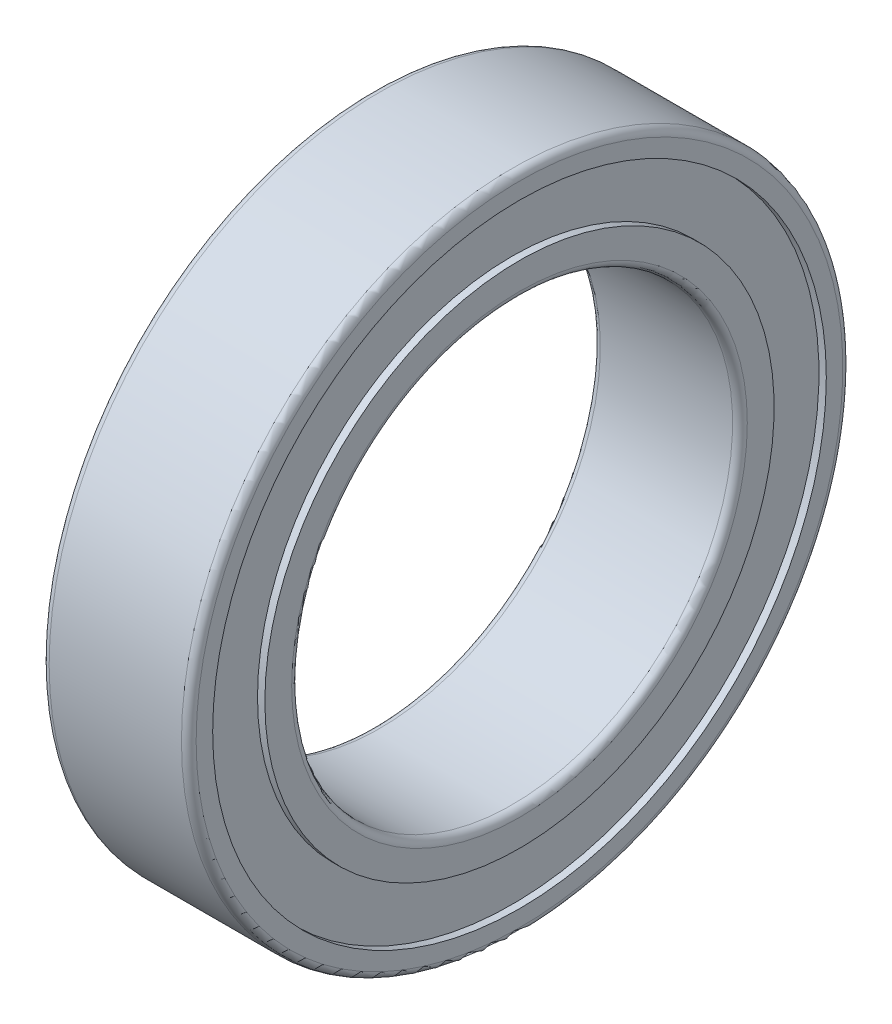
ISO-10303-21;
HEADER;
FILE_DESCRIPTION(('STEP AP214'),'2;1');
FILE_NAME('part.step','',(''),(''),'','','');
FILE_SCHEMA(('AUTOMOTIVE_DESIGN { 1 0 10303 214 1 1 1 1 }'));
ENDSEC;
DATA;
#1=APPLICATION_CONTEXT('core data for automotive mechanical design processes');
#2=APPLICATION_PROTOCOL_DEFINITION('international standard','automotive_design',2000,#1);
#3=PRODUCT_CONTEXT('',#1,'mechanical');
#4=PRODUCT('Part','Part','',(#3));
#5=PRODUCT_RELATED_PRODUCT_CATEGORY('part','',(#4));
#6=PRODUCT_DEFINITION_FORMATION('','',#4);
#7=PRODUCT_DEFINITION_CONTEXT('part definition',#1,'design');
#8=PRODUCT_DEFINITION('design','',#6,#7);
#9=PRODUCT_DEFINITION_SHAPE('','',#8);
#10=(LENGTH_UNIT() NAMED_UNIT(*) SI_UNIT(.MILLI.,.METRE.));
#11=(NAMED_UNIT(*) PLANE_ANGLE_UNIT() SI_UNIT($,.RADIAN.));
#12=(NAMED_UNIT(*) SI_UNIT($,.STERADIAN.) SOLID_ANGLE_UNIT());
#13=UNCERTAINTY_MEASURE_WITH_UNIT(LENGTH_MEASURE(1.E-05),#10,'distance_accuracy_value','');
#14=(GEOMETRIC_REPRESENTATION_CONTEXT(3) GLOBAL_UNCERTAINTY_ASSIGNED_CONTEXT((#13)) GLOBAL_UNIT_ASSIGNED_CONTEXT((#10,
#11,#12)) REPRESENTATION_CONTEXT('',''));
#15=CARTESIAN_POINT('',(0.,0.,0.));
#16=DIRECTION('',(0.,0.,1.));
#17=DIRECTION('',(1.,0.,0.));
#18=AXIS2_PLACEMENT_3D('',#15,#16,#17);
#19=CARTESIAN_POINT('',(0.,-7.11935501410131,-6.93));
#20=DIRECTION('',(-1.,0.,0.));
#21=DIRECTION('',(0.,0.,1.));
#22=AXIS2_PLACEMENT_3D('',#19,#20,#21);
#23=PLANE('',#22);
#24=CARTESIAN_POINT('',(0.,0.,0.));
#25=DIRECTION('',(-1.,0.,0.));
#26=DIRECTION('',(0.,0.,-1.));
#27=AXIS2_PLACEMENT_3D('',#24,#25,#26);
#28=CIRCLE('',#27,6.93);
#29=CARTESIAN_POINT('',(0.,0.,-6.93));
#30=VERTEX_POINT('',#29);
#31=EDGE_CURVE('E68',#30,#30,#28,.F.);
#32=ORIENTED_EDGE('',*,*,#31,.F.);
#33=EDGE_LOOP('',(#32));
#34=FACE_BOUND('',#33,.T.);
#35=CARTESIAN_POINT('',(0.,0.,0.));
#36=DIRECTION('',(1.,0.,0.));
#37=DIRECTION('',(0.,0.,1.));
#38=AXIS2_PLACEMENT_3D('',#35,#36,#37);
#39=CIRCLE('',#38,6.2);
#40=CARTESIAN_POINT('',(0.,0.,6.2));
#41=VERTEX_POINT('',#40);
#42=EDGE_CURVE('E65',#41,#41,#39,.T.);
#43=ORIENTED_EDGE('',*,*,#42,.T.);
#44=EDGE_LOOP('',(#43));
#45=FACE_BOUND('',#44,.T.);
#46=ADVANCED_FACE('F15',(#34,#45),#23,.T.);
#47=CARTESIAN_POINT('',(4.,-7.11935501475615,6.93));
#48=DIRECTION('',(1.,0.,0.));
#49=DIRECTION('',(0.,0.,-1.));
#50=AXIS2_PLACEMENT_3D('',#47,#48,#49);
#51=PLANE('',#50);
#52=CARTESIAN_POINT('',(4.,0.,0.));
#53=DIRECTION('',(1.,0.,0.));
#54=DIRECTION('',(0.,-1.16852482476126E-09,1.));
#55=AXIS2_PLACEMENT_3D('',#52,#53,#54);
#56=CIRCLE('',#55,6.93);
#57=CARTESIAN_POINT('',(4.,-8.0978770355955E-09,6.93));
#58=VERTEX_POINT('',#57);
#59=EDGE_CURVE('E62',#58,#58,#56,.T.);
#60=ORIENTED_EDGE('',*,*,#59,.T.);
#61=EDGE_LOOP('',(#60));
#62=FACE_BOUND('',#61,.T.);
#63=CARTESIAN_POINT('',(4.,0.,0.));
#64=DIRECTION('',(-1.,0.,0.));
#65=DIRECTION('',(0.,0.,-1.));
#66=AXIS2_PLACEMENT_3D('',#63,#64,#65);
#67=CIRCLE('',#66,6.20000011099115);
#68=CARTESIAN_POINT('',(4.,0.,-6.20000011099115));
#69=VERTEX_POINT('',#68);
#70=EDGE_CURVE('E59',#69,#69,#67,.F.);
#71=ORIENTED_EDGE('',*,*,#70,.F.);
#72=EDGE_LOOP('',(#71));
#73=FACE_BOUND('',#72,.T.);
#74=ADVANCED_FACE('F76',(#62,#73),#51,.T.);
#75=CARTESIAN_POINT('',(3.8,-8.57815504645105,8.35));
#76=DIRECTION('',(1.,0.,0.));
#77=DIRECTION('',(0.,0.,-1.));
#78=AXIS2_PLACEMENT_3D('',#75,#76,#77);
#79=PLANE('',#78);
#80=CARTESIAN_POINT('',(3.8,0.,0.));
#81=DIRECTION('',(1.,0.,0.));
#82=DIRECTION('',(0.,0.,1.));
#83=AXIS2_PLACEMENT_3D('',#80,#81,#82);
#84=CIRCLE('',#83,8.35);
#85=CARTESIAN_POINT('',(3.8,0.,8.35));
#86=VERTEX_POINT('',#85);
#87=EDGE_CURVE('E56',#86,#86,#84,.T.);
#88=ORIENTED_EDGE('',*,*,#87,.T.);
#89=EDGE_LOOP('',(#88));
#90=FACE_BOUND('',#89,.T.);
#91=CARTESIAN_POINT('',(3.8,0.,0.));
#92=DIRECTION('',(-1.,0.,0.));
#93=DIRECTION('',(0.,0.,-1.));
#94=AXIS2_PLACEMENT_3D('',#91,#92,#93);
#95=CIRCLE('',#94,6.93);
#96=CARTESIAN_POINT('',(3.8,0.,-6.93));
#97=VERTEX_POINT('',#96);
#98=EDGE_CURVE('E53',#97,#97,#95,.F.);
#99=ORIENTED_EDGE('',*,*,#98,.F.);
#100=EDGE_LOOP('',(#99));
#101=FACE_BOUND('',#100,.T.);
#102=ADVANCED_FACE('F135',(#90,#101),#79,.T.);
#103=CARTESIAN_POINT('',(4.,-9.04045082739751,8.8));
#104=DIRECTION('',(1.,0.,0.));
#105=DIRECTION('',(0.,0.,-1.));
#106=AXIS2_PLACEMENT_3D('',#103,#104,#105);
#107=PLANE('',#106);
#108=CARTESIAN_POINT('',(4.,0.,0.));
#109=DIRECTION('',(1.,0.,0.));
#110=DIRECTION('',(0.,0.,1.));
#111=AXIS2_PLACEMENT_3D('',#108,#109,#110);
#112=CIRCLE('',#111,8.80000011714246);
#113=CARTESIAN_POINT('',(4.,0.,8.80000011714246));
#114=VERTEX_POINT('',#113);
#115=EDGE_CURVE('E50',#114,#114,#112,.T.);
#116=ORIENTED_EDGE('',*,*,#115,.T.);
#117=EDGE_LOOP('',(#116));
#118=FACE_BOUND('',#117,.T.);
#119=CARTESIAN_POINT('',(4.,0.,0.));
#120=DIRECTION('',(-1.,0.,0.));
#121=DIRECTION('',(0.,0.,-1.));
#122=AXIS2_PLACEMENT_3D('',#119,#120,#121);
#123=CIRCLE('',#122,8.35);
#124=CARTESIAN_POINT('',(4.,0.,-8.35));
#125=VERTEX_POINT('',#124);
#126=EDGE_CURVE('E47',#125,#125,#123,.F.);
#127=ORIENTED_EDGE('',*,*,#126,.F.);
#128=EDGE_LOOP('',(#127));
#129=FACE_BOUND('',#128,.T.);
#130=ADVANCED_FACE('F130',(#118,#129),#107,.T.);
#131=CARTESIAN_POINT('',(0.,-9.04045082739751,-8.8));
#132=DIRECTION('',(-1.,0.,0.));
#133=DIRECTION('',(0.,0.,1.));
#134=AXIS2_PLACEMENT_3D('',#131,#132,#133);
#135=PLANE('',#134);
#136=CARTESIAN_POINT('',(0.,0.,0.));
#137=DIRECTION('',(-1.,0.,0.));
#138=DIRECTION('',(0.,0.,-1.));
#139=AXIS2_PLACEMENT_3D('',#136,#137,#138);
#140=CIRCLE('',#139,8.80000000942432);
#141=CARTESIAN_POINT('',(0.,0.,-8.80000000942432));
#142=VERTEX_POINT('',#141);
#143=EDGE_CURVE('E44',#142,#142,#140,.F.);
#144=ORIENTED_EDGE('',*,*,#143,.F.);
#145=EDGE_LOOP('',(#144));
#146=FACE_BOUND('',#145,.T.);
#147=CARTESIAN_POINT('',(0.,0.,0.));
#148=DIRECTION('',(1.,0.,0.));
#149=DIRECTION('',(0.,0.,1.));
#150=AXIS2_PLACEMENT_3D('',#147,#148,#149);
#151=CIRCLE('',#150,8.35);
#152=CARTESIAN_POINT('',(0.,0.,8.35));
#153=VERTEX_POINT('',#152);
#154=EDGE_CURVE('E41',#153,#153,#151,.T.);
#155=ORIENTED_EDGE('',*,*,#154,.T.);
#156=EDGE_LOOP('',(#155));
#157=FACE_BOUND('',#156,.T.);
#158=ADVANCED_FACE('F94',(#146,#157),#135,.T.);
#159=CARTESIAN_POINT('',(0.2,-8.57815504645105,-8.35));
#160=DIRECTION('',(-1.,0.,0.));
#161=DIRECTION('',(0.,0.,1.));
#162=AXIS2_PLACEMENT_3D('',#159,#160,#161);
#163=PLANE('',#162);
#164=CARTESIAN_POINT('',(0.2,0.,0.));
#165=DIRECTION('',(-1.,0.,0.));
#166=DIRECTION('',(0.,0.,-1.));
#167=AXIS2_PLACEMENT_3D('',#164,#165,#166);
#168=CIRCLE('',#167,8.35);
#169=CARTESIAN_POINT('',(0.2,0.,-8.35));
#170=VERTEX_POINT('',#169);
#171=EDGE_CURVE('E38',#170,#170,#168,.F.);
#172=ORIENTED_EDGE('',*,*,#171,.F.);
#173=EDGE_LOOP('',(#172));
#174=FACE_BOUND('',#173,.T.);
#175=CARTESIAN_POINT('',(0.2,0.,0.));
#176=DIRECTION('',(1.,0.,0.));
#177=DIRECTION('',(0.,0.,1.));
#178=AXIS2_PLACEMENT_3D('',#175,#176,#177);
#179=CIRCLE('',#178,6.93);
#180=CARTESIAN_POINT('',(0.2,0.,6.93));
#181=VERTEX_POINT('',#180);
#182=EDGE_CURVE('E35',#181,#181,#179,.T.);
#183=ORIENTED_EDGE('',*,*,#182,.T.);
#184=EDGE_LOOP('',(#183));
#185=FACE_BOUND('',#184,.T.);
#186=ADVANCED_FACE('F83',(#174,#185),#163,.T.);
#187=CARTESIAN_POINT('',(0.200000000000014,0.,0.));
#188=DIRECTION('',(1.,0.,0.));
#189=DIRECTION('',(0.,0.,1.));
#190=AXIS2_PLACEMENT_3D('',#187,#188,#189);
#191=TOROIDAL_SURFACE('',#190,6.2,0.200000000000014);
#192=CARTESIAN_POINT('',(0.2,0.,0.));
#193=DIRECTION('',(1.,0.,0.));
#194=DIRECTION('',(0.,0.,1.));
#195=AXIS2_PLACEMENT_3D('',#192,#193,#194);
#196=CIRCLE('',#195,5.99999999999999);
#197=CARTESIAN_POINT('',(0.2,0.,5.99999999999999));
#198=VERTEX_POINT('',#197);
#199=EDGE_CURVE('E30',#198,#198,#196,.T.);
#200=ORIENTED_EDGE('',*,*,#199,.T.);
#201=EDGE_LOOP('',(#200));
#202=FACE_BOUND('',#201,.T.);
#203=ORIENTED_EDGE('',*,*,#42,.F.);
#204=EDGE_LOOP('',(#203));
#205=FACE_BOUND('',#204,.T.);
#206=ADVANCED_FACE('F80',(#202,#205),#191,.T.);
#207=CARTESIAN_POINT('',(4.,0.,0.));
#208=DIRECTION('',(1.,0.,0.));
#209=DIRECTION('',(0.,0.,1.));
#210=AXIS2_PLACEMENT_3D('',#207,#208,#209);
#211=CYLINDRICAL_SURFACE('',#210,6.);
#212=CARTESIAN_POINT('',(3.8,0.,0.));
#213=DIRECTION('',(1.,0.,0.));
#214=DIRECTION('',(0.,0.,1.));
#215=AXIS2_PLACEMENT_3D('',#212,#213,#214);
#216=CIRCLE('',#215,6.);
#217=CARTESIAN_POINT('',(3.8,0.,6.));
#218=VERTEX_POINT('',#217);
#219=EDGE_CURVE('E26',#218,#218,#216,.T.);
#220=ORIENTED_EDGE('',*,*,#219,.T.);
#221=EDGE_LOOP('',(#220));
#222=FACE_BOUND('',#221,.T.);
#223=ORIENTED_EDGE('',*,*,#199,.F.);
#224=EDGE_LOOP('',(#223));
#225=FACE_BOUND('',#224,.T.);
#226=ADVANCED_FACE('F82',(#222,#225),#211,.F.);
#227=CARTESIAN_POINT('',(3.8,0.,0.));
#228=DIRECTION('',(1.,0.,0.));
#229=DIRECTION('',(0.,0.,1.));
#230=AXIS2_PLACEMENT_3D('',#227,#228,#229);
#231=TOROIDAL_SURFACE('',#230,6.2,0.200000000000031);
#232=ORIENTED_EDGE('',*,*,#70,.T.);
#233=EDGE_LOOP('',(#232));
#234=FACE_BOUND('',#233,.T.);
#235=ORIENTED_EDGE('',*,*,#219,.F.);
#236=EDGE_LOOP('',(#235));
#237=FACE_BOUND('',#236,.T.);
#238=ADVANCED_FACE('F91',(#234,#237),#231,.T.);
#239=CARTESIAN_POINT('',(4.,0.,0.));
#240=DIRECTION('',(1.,0.,0.));
#241=DIRECTION('',(0.,0.,1.));
#242=AXIS2_PLACEMENT_3D('',#239,#240,#241);
#243=CYLINDRICAL_SURFACE('',#242,6.93);
#244=ORIENTED_EDGE('',*,*,#98,.T.);
#245=EDGE_LOOP('',(#244));
#246=FACE_BOUND('',#245,.T.);
#247=ORIENTED_EDGE('',*,*,#59,.F.);
#248=EDGE_LOOP('',(#247));
#249=FACE_BOUND('',#248,.T.);
#250=ADVANCED_FACE('F101',(#246,#249),#243,.T.);
#251=CARTESIAN_POINT('',(4.,0.,0.));
#252=DIRECTION('',(1.,0.,0.));
#253=DIRECTION('',(0.,0.,1.));
#254=AXIS2_PLACEMENT_3D('',#251,#252,#253);
#255=CYLINDRICAL_SURFACE('',#254,8.35);
#256=ORIENTED_EDGE('',*,*,#126,.T.);
#257=EDGE_LOOP('',(#256));
#258=FACE_BOUND('',#257,.T.);
#259=ORIENTED_EDGE('',*,*,#87,.F.);
#260=EDGE_LOOP('',(#259));
#261=FACE_BOUND('',#260,.T.);
#262=ADVANCED_FACE('F105',(#258,#261),#255,.F.);
#263=CARTESIAN_POINT('',(3.8,0.,0.));
#264=DIRECTION('',(1.,0.,0.));
#265=DIRECTION('',(0.,0.,1.));
#266=AXIS2_PLACEMENT_3D('',#263,#264,#265);
#267=TOROIDAL_SURFACE('',#266,8.8,0.200000000000034);
#268=CARTESIAN_POINT('',(3.8,0.,0.));
#269=DIRECTION('',(1.,0.,0.));
#270=DIRECTION('',(0.,0.,1.));
#271=AXIS2_PLACEMENT_3D('',#268,#269,#270);
#272=CIRCLE('',#271,9.00000000000004);
#273=CARTESIAN_POINT('',(3.8,0.,9.00000000000004));
#274=VERTEX_POINT('',#273);
#275=EDGE_CURVE('E22',#274,#274,#272,.T.);
#276=ORIENTED_EDGE('',*,*,#275,.T.);
#277=EDGE_LOOP('',(#276));
#278=FACE_BOUND('',#277,.T.);
#279=ORIENTED_EDGE('',*,*,#115,.F.);
#280=EDGE_LOOP('',(#279));
#281=FACE_BOUND('',#280,.T.);
#282=ADVANCED_FACE('F109',(#278,#281),#267,.T.);
#283=CARTESIAN_POINT('',(4.,0.,0.));
#284=DIRECTION('',(1.,0.,0.));
#285=DIRECTION('',(0.,0.,1.));
#286=AXIS2_PLACEMENT_3D('',#283,#284,#285);
#287=CYLINDRICAL_SURFACE('',#286,9.);
#288=CARTESIAN_POINT('',(0.2,0.,0.));
#289=DIRECTION('',(1.,0.,0.));
#290=DIRECTION('',(0.,0.,1.));
#291=AXIS2_PLACEMENT_3D('',#288,#289,#290);
#292=CIRCLE('',#291,9.);
#293=CARTESIAN_POINT('',(0.2,0.,9.));
#294=VERTEX_POINT('',#293);
#295=EDGE_CURVE('E10',#294,#294,#292,.T.);
#296=ORIENTED_EDGE('',*,*,#295,.T.);
#297=EDGE_LOOP('',(#296));
#298=FACE_BOUND('',#297,.T.);
#299=ORIENTED_EDGE('',*,*,#275,.F.);
#300=EDGE_LOOP('',(#299));
#301=FACE_BOUND('',#300,.T.);
#302=ADVANCED_FACE('F113',(#298,#301),#287,.T.);
#303=CARTESIAN_POINT('',(0.200000000000019,0.,0.));
#304=DIRECTION('',(1.,0.,0.));
#305=DIRECTION('',(0.,0.,1.));
#306=AXIS2_PLACEMENT_3D('',#303,#304,#305);
#307=TOROIDAL_SURFACE('',#306,8.8,0.200000000000019);
#308=ORIENTED_EDGE('',*,*,#143,.T.);
#309=EDGE_LOOP('',(#308));
#310=FACE_BOUND('',#309,.T.);
#311=ORIENTED_EDGE('',*,*,#295,.F.);
#312=EDGE_LOOP('',(#311));
#313=FACE_BOUND('',#312,.T.);
#314=ADVANCED_FACE('F116',(#310,#313),#307,.T.);
#315=CARTESIAN_POINT('',(4.,0.,0.));
#316=DIRECTION('',(1.,0.,0.));
#317=DIRECTION('',(0.,0.,1.));
#318=AXIS2_PLACEMENT_3D('',#315,#316,#317);
#319=CYLINDRICAL_SURFACE('',#318,8.35);
#320=ORIENTED_EDGE('',*,*,#171,.T.);
#321=EDGE_LOOP('',(#320));
#322=FACE_BOUND('',#321,.T.);
#323=ORIENTED_EDGE('',*,*,#154,.F.);
#324=EDGE_LOOP('',(#323));
#325=FACE_BOUND('',#324,.T.);
#326=ADVANCED_FACE('F118',(#322,#325),#319,.F.);
#327=CARTESIAN_POINT('',(4.,0.,0.));
#328=DIRECTION('',(1.,0.,0.));
#329=DIRECTION('',(0.,0.,1.));
#330=AXIS2_PLACEMENT_3D('',#327,#328,#329);
#331=CYLINDRICAL_SURFACE('',#330,6.93);
#332=ORIENTED_EDGE('',*,*,#31,.T.);
#333=EDGE_LOOP('',(#332));
#334=FACE_BOUND('',#333,.T.);
#335=ORIENTED_EDGE('',*,*,#182,.F.);
#336=EDGE_LOOP('',(#335));
#337=FACE_BOUND('',#336,.T.);
#338=ADVANCED_FACE('F17',(#334,#337),#331,.T.);
#339=CLOSED_SHELL('',(#46,#74,#102,#130,#158,#186,#206,#226,#238,#250,#262,#282,#302,#314,#326,#338));
#340=MANIFOLD_SOLID_BREP('B1',#339);
#341=ADVANCED_BREP_SHAPE_REPRESENTATION('',(#18,#340),#14);
#342=SHAPE_DEFINITION_REPRESENTATION(#9,#341);
ENDSEC;
END-ISO-10303-21;
